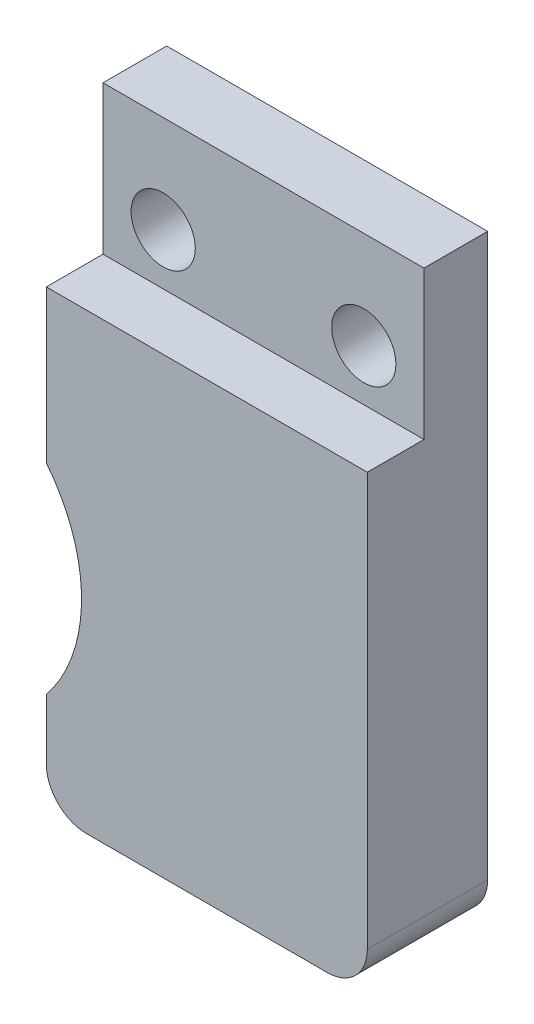
ISO-10303-21;
HEADER;
FILE_DESCRIPTION(('STEP AP214'),'2;1');
FILE_NAME('part.step','',(''),(''),'','','');
FILE_SCHEMA(('AUTOMOTIVE_DESIGN { 1 0 10303 214 1 1 1 1 }'));
ENDSEC;
DATA;
#1=APPLICATION_CONTEXT('core data for automotive mechanical design processes');
#2=APPLICATION_PROTOCOL_DEFINITION('international standard','automotive_design',2000,#1);
#3=PRODUCT_CONTEXT('',#1,'mechanical');
#4=PRODUCT('Part','Part','',(#3));
#5=PRODUCT_RELATED_PRODUCT_CATEGORY('part','',(#4));
#6=PRODUCT_DEFINITION_FORMATION('','',#4);
#7=PRODUCT_DEFINITION_CONTEXT('part definition',#1,'design');
#8=PRODUCT_DEFINITION('design','',#6,#7);
#9=PRODUCT_DEFINITION_SHAPE('','',#8);
#10=(LENGTH_UNIT() NAMED_UNIT(*) SI_UNIT(.MILLI.,.METRE.));
#11=(NAMED_UNIT(*) PLANE_ANGLE_UNIT() SI_UNIT($,.RADIAN.));
#12=(NAMED_UNIT(*) SI_UNIT($,.STERADIAN.) SOLID_ANGLE_UNIT());
#13=UNCERTAINTY_MEASURE_WITH_UNIT(LENGTH_MEASURE(1.E-05),#10,'distance_accuracy_value','');
#14=(GEOMETRIC_REPRESENTATION_CONTEXT(3) GLOBAL_UNCERTAINTY_ASSIGNED_CONTEXT((#13)) GLOBAL_UNIT_ASSIGNED_CONTEXT((#10,
#11,#12)) REPRESENTATION_CONTEXT('',''));
#15=CARTESIAN_POINT('',(0.,0.,0.));
#16=DIRECTION('',(0.,0.,1.));
#17=DIRECTION('',(1.,0.,0.));
#18=AXIS2_PLACEMENT_3D('',#15,#16,#17);
#19=CARTESIAN_POINT('',(-8.,-50.,3.175));
#20=DIRECTION('',(1.,0.,0.));
#21=DIRECTION('',(0.,1.,0.));
#22=AXIS2_PLACEMENT_3D('',#19,#20,#21);
#23=PLANE('',#22);
#24=DIRECTION('',(0.,-1.,0.));
#25=VECTOR('',#24,1.);
#26=CARTESIAN_POINT('',(-8.,-50.,0.));
#27=LINE('',#26,#25);
#28=CARTESIAN_POINT('',(-8.00000000000001,-20.,0.));
#29=VERTEX_POINT('',#28);
#30=CARTESIAN_POINT('',(-8.00000000000001,-35.,0.));
#31=VERTEX_POINT('',#30);
#32=EDGE_CURVE('E136',#29,#31,#27,.T.);
#33=ORIENTED_EDGE('',*,*,#32,.T.);
#34=DIRECTION('',(0.,0.,1.));
#35=VECTOR('',#34,1.);
#36=CARTESIAN_POINT('',(-8.00000000000001,-35.,0.));
#37=LINE('',#36,#35);
#38=CARTESIAN_POINT('',(-8.00000000000001,-35.,6.));
#39=VERTEX_POINT('',#38);
#40=EDGE_CURVE('E122',#31,#39,#37,.T.);
#41=ORIENTED_EDGE('',*,*,#40,.T.);
#42=DIRECTION('',(0.,1.,0.));
#43=VECTOR('',#42,1.);
#44=CARTESIAN_POINT('',(-8.,-50.,6.));
#45=LINE('',#44,#43);
#46=CARTESIAN_POINT('',(-8.00000000000001,-27.4,6.));
#47=VERTEX_POINT('',#46);
#48=EDGE_CURVE('E132',#39,#47,#45,.T.);
#49=ORIENTED_EDGE('',*,*,#48,.T.);
#50=DIRECTION('',(0.,0.,-1.));
#51=VECTOR('',#50,1.);
#52=CARTESIAN_POINT('',(-8.00000000000001,-27.4,6.));
#53=LINE('',#52,#51);
#54=CARTESIAN_POINT('',(-8.00000000000001,-27.4,3.175));
#55=VERTEX_POINT('',#54);
#56=EDGE_CURVE('E157',#47,#55,#53,.T.);
#57=ORIENTED_EDGE('',*,*,#56,.T.);
#58=DIRECTION('',(0.,-1.,0.));
#59=VECTOR('',#58,1.);
#60=CARTESIAN_POINT('',(-8.,-50.,3.175));
#61=LINE('',#60,#59);
#62=CARTESIAN_POINT('',(-8.00000000000001,-20.,3.175));
#63=VERTEX_POINT('',#62);
#64=EDGE_CURVE('E191',#63,#55,#61,.T.);
#65=ORIENTED_EDGE('',*,*,#64,.F.);
#66=DIRECTION('',(0.,0.,-1.));
#67=VECTOR('',#66,1.);
#68=CARTESIAN_POINT('',(-8.00000000000001,-20.,3.175));
#69=LINE('',#68,#67);
#70=EDGE_CURVE('E194',#63,#29,#69,.T.);
#71=ORIENTED_EDGE('',*,*,#70,.T.);
#72=EDGE_LOOP('',(#33,#41,#49,#57,#65,#71));
#73=FACE_BOUND('',#72,.T.);
#74=ADVANCED_FACE('F45',(#73),#23,.F.);
#75=CARTESIAN_POINT('',(0.,0.,3.175));
#76=DIRECTION('',(0.,0.,-1.));
#77=DIRECTION('',(-1.,0.,0.));
#78=AXIS2_PLACEMENT_3D('',#75,#76,#77);
#79=PLANE('',#78);
#80=ORIENTED_EDGE('',*,*,#64,.T.);
#81=DIRECTION('',(1.,0.,0.));
#82=VECTOR('',#81,1.);
#83=CARTESIAN_POINT('',(0.,-27.4,3.175));
#84=LINE('',#83,#82);
#85=CARTESIAN_POINT('',(8.,-27.4,3.175));
#86=VERTEX_POINT('',#85);
#87=EDGE_CURVE('E162',#55,#86,#84,.T.);
#88=ORIENTED_EDGE('',*,*,#87,.T.);
#89=DIRECTION('',(0.,1.,0.));
#90=VECTOR('',#89,1.);
#91=CARTESIAN_POINT('',(8.,-50.,3.175));
#92=LINE('',#91,#90);
#93=CARTESIAN_POINT('',(8.,-20.,3.175));
#94=VERTEX_POINT('',#93);
#95=EDGE_CURVE('E184',#86,#94,#92,.T.);
#96=ORIENTED_EDGE('',*,*,#95,.T.);
#97=DIRECTION('',(-1.,0.,0.));
#98=VECTOR('',#97,1.);
#99=CARTESIAN_POINT('',(-8.00000000000001,-20.,3.175));
#100=LINE('',#99,#98);
#101=EDGE_CURVE('E187',#94,#63,#100,.T.);
#102=ORIENTED_EDGE('',*,*,#101,.T.);
#103=EDGE_LOOP('',(#80,#88,#96,#102));
#104=FACE_BOUND('',#103,.T.);
#105=CARTESIAN_POINT('',(-5.00000000000001,-24.85,3.175));
#106=DIRECTION('',(0.,0.,1.));
#107=DIRECTION('',(1.,0.,0.));
#108=AXIS2_PLACEMENT_3D('',#105,#106,#107);
#109=CIRCLE('',#108,1.6);
#110=CARTESIAN_POINT('',(-3.40000000000001,-24.85,3.175));
#111=VERTEX_POINT('',#110);
#112=EDGE_CURVE('E176',#111,#111,#109,.T.);
#113=ORIENTED_EDGE('',*,*,#112,.F.);
#114=EDGE_LOOP('',(#113));
#115=FACE_BOUND('',#114,.T.);
#116=CARTESIAN_POINT('',(4.99999999999999,-24.85,3.175));
#117=DIRECTION('',(0.,0.,1.));
#118=DIRECTION('',(1.,0.,0.));
#119=AXIS2_PLACEMENT_3D('',#116,#117,#118);
#120=CIRCLE('',#119,1.59999999999999);
#121=CARTESIAN_POINT('',(6.59999999999999,-24.85,3.175));
#122=VERTEX_POINT('',#121);
#123=EDGE_CURVE('E168',#122,#122,#120,.T.);
#124=ORIENTED_EDGE('',*,*,#123,.F.);
#125=EDGE_LOOP('',(#124));
#126=FACE_BOUND('',#125,.T.);
#127=ADVANCED_FACE('F276',(#104,#115,#126),#79,.F.);
#128=CARTESIAN_POINT('',(0.,0.,0.));
#129=DIRECTION('',(0.,0.,-1.));
#130=DIRECTION('',(-1.,0.,0.));
#131=AXIS2_PLACEMENT_3D('',#128,#129,#130);
#132=PLANE('',#131);
#133=CARTESIAN_POINT('',(-14.2449979983984,-40.,0.));
#134=DIRECTION('',(0.,0.,1.));
#135=DIRECTION('',(1.,0.,0.));
#136=AXIS2_PLACEMENT_3D('',#133,#134,#135);
#137=CIRCLE('',#136,8.);
#138=CARTESIAN_POINT('',(-8.00000000000001,-45.,0.));
#139=VERTEX_POINT('',#138);
#140=EDGE_CURVE('E127',#139,#31,#137,.T.);
#141=ORIENTED_EDGE('',*,*,#140,.T.);
#142=ORIENTED_EDGE('',*,*,#32,.F.);
#143=DIRECTION('',(-1.,0.,0.));
#144=VECTOR('',#143,1.);
#145=CARTESIAN_POINT('',(-8.00000000000001,-20.,0.));
#146=LINE('',#145,#144);
#147=CARTESIAN_POINT('',(8.,-20.,0.));
#148=VERTEX_POINT('',#147);
#149=EDGE_CURVE('E197',#148,#29,#146,.T.);
#150=ORIENTED_EDGE('',*,*,#149,.F.);
#151=DIRECTION('',(0.,1.,0.));
#152=VECTOR('',#151,1.);
#153=CARTESIAN_POINT('',(8.,-50.,0.));
#154=LINE('',#153,#152);
#155=CARTESIAN_POINT('',(8.,-48.,0.));
#156=VERTEX_POINT('',#155);
#157=EDGE_CURVE('E180',#156,#148,#154,.T.);
#158=ORIENTED_EDGE('',*,*,#157,.F.);
#159=CARTESIAN_POINT('',(6.,-48.,0.));
#160=DIRECTION('',(0.,0.,-1.));
#161=DIRECTION('',(-1.,0.,0.));
#162=AXIS2_PLACEMENT_3D('',#159,#160,#161);
#163=CIRCLE('',#162,2.);
#164=CARTESIAN_POINT('',(6.,-50.,0.));
#165=VERTEX_POINT('',#164);
#166=EDGE_CURVE('E220',#156,#165,#163,.T.);
#167=ORIENTED_EDGE('',*,*,#166,.T.);
#168=DIRECTION('',(1.,0.,0.));
#169=VECTOR('',#168,1.);
#170=CARTESIAN_POINT('',(-8.,-50.,0.));
#171=LINE('',#170,#169);
#172=CARTESIAN_POINT('',(-6.,-50.,0.));
#173=VERTEX_POINT('',#172);
#174=EDGE_CURVE('E188',#173,#165,#171,.T.);
#175=ORIENTED_EDGE('',*,*,#174,.F.);
#176=CARTESIAN_POINT('',(-6.,-48.,0.));
#177=DIRECTION('',(0.,0.,-1.));
#178=DIRECTION('',(-1.,0.,0.));
#179=AXIS2_PLACEMENT_3D('',#176,#177,#178);
#180=CIRCLE('',#179,2.);
#181=CARTESIAN_POINT('',(-8.,-48.,0.));
#182=VERTEX_POINT('',#181);
#183=EDGE_CURVE('E216',#173,#182,#180,.T.);
#184=ORIENTED_EDGE('',*,*,#183,.T.);
#185=EDGE_CURVE('E200',#139,#182,#27,.T.);
#186=ORIENTED_EDGE('',*,*,#185,.F.);
#187=EDGE_LOOP('',(#141,#142,#150,#158,#167,#175,#184,#186));
#188=FACE_BOUND('',#187,.T.);
#189=CARTESIAN_POINT('',(-5.00000000000001,-24.85,0.));
#190=DIRECTION('',(0.,0.,1.));
#191=DIRECTION('',(1.,0.,0.));
#192=AXIS2_PLACEMENT_3D('',#189,#190,#191);
#193=CIRCLE('',#192,1.6);
#194=CARTESIAN_POINT('',(-3.40000000000001,-24.85,0.));
#195=VERTEX_POINT('',#194);
#196=EDGE_CURVE('E172',#195,#195,#193,.T.);
#197=ORIENTED_EDGE('',*,*,#196,.T.);
#198=EDGE_LOOP('',(#197));
#199=FACE_BOUND('',#198,.T.);
#200=CARTESIAN_POINT('',(4.99999999999999,-24.85,0.));
#201=DIRECTION('',(0.,0.,1.));
#202=DIRECTION('',(1.,0.,0.));
#203=AXIS2_PLACEMENT_3D('',#200,#201,#202);
#204=CIRCLE('',#203,1.59999999999999);
#205=CARTESIAN_POINT('',(6.59999999999999,-24.85,0.));
#206=VERTEX_POINT('',#205);
#207=EDGE_CURVE('E167',#206,#206,#204,.T.);
#208=ORIENTED_EDGE('',*,*,#207,.T.);
#209=EDGE_LOOP('',(#208));
#210=FACE_BOUND('',#209,.T.);
#211=ADVANCED_FACE('F247',(#188,#199,#210),#132,.T.);
#212=CARTESIAN_POINT('',(8.,-50.,3.175));
#213=DIRECTION('',(-1.,0.,0.));
#214=DIRECTION('',(0.,0.,1.));
#215=AXIS2_PLACEMENT_3D('',#212,#213,#214);
#216=PLANE('',#215);
#217=DIRECTION('',(0.,-1.,0.));
#218=VECTOR('',#217,1.);
#219=CARTESIAN_POINT('',(8.,-50.,6.));
#220=LINE('',#219,#218);
#221=CARTESIAN_POINT('',(8.,-27.4,6.));
#222=VERTEX_POINT('',#221);
#223=CARTESIAN_POINT('',(8.,-48.,6.));
#224=VERTEX_POINT('',#223);
#225=EDGE_CURVE('E151',#222,#224,#220,.T.);
#226=ORIENTED_EDGE('',*,*,#225,.T.);
#227=DIRECTION('',(0.,0.,-1.));
#228=VECTOR('',#227,1.);
#229=CARTESIAN_POINT('',(8.,-48.,3.175));
#230=LINE('',#229,#228);
#231=EDGE_CURVE('E212',#224,#156,#230,.T.);
#232=ORIENTED_EDGE('',*,*,#231,.T.);
#233=ORIENTED_EDGE('',*,*,#157,.T.);
#234=DIRECTION('',(0.,0.,-1.));
#235=VECTOR('',#234,1.);
#236=CARTESIAN_POINT('',(8.,-20.,3.175));
#237=LINE('',#236,#235);
#238=EDGE_CURVE('E208',#94,#148,#237,.T.);
#239=ORIENTED_EDGE('',*,*,#238,.F.);
#240=ORIENTED_EDGE('',*,*,#95,.F.);
#241=DIRECTION('',(0.,0.,-1.));
#242=VECTOR('',#241,1.);
#243=CARTESIAN_POINT('',(8.,-27.4,6.));
#244=LINE('',#243,#242);
#245=EDGE_CURVE('E158',#222,#86,#244,.T.);
#246=ORIENTED_EDGE('',*,*,#245,.F.);
#247=EDGE_LOOP('',(#226,#232,#233,#239,#240,#246));
#248=FACE_BOUND('',#247,.T.);
#249=ADVANCED_FACE('F240',(#248),#216,.F.);
#250=CARTESIAN_POINT('',(-8.00000000000001,-20.,3.175));
#251=DIRECTION('',(0.,-1.,0.));
#252=DIRECTION('',(1.,0.,0.));
#253=AXIS2_PLACEMENT_3D('',#250,#251,#252);
#254=PLANE('',#253);
#255=ORIENTED_EDGE('',*,*,#149,.T.);
#256=ORIENTED_EDGE('',*,*,#70,.F.);
#257=ORIENTED_EDGE('',*,*,#101,.F.);
#258=ORIENTED_EDGE('',*,*,#238,.T.);
#259=EDGE_LOOP('',(#255,#256,#257,#258));
#260=FACE_BOUND('',#259,.T.);
#261=ADVANCED_FACE('F263',(#260),#254,.F.);
#262=CARTESIAN_POINT('',(-8.,-48.,6.));
#263=VERTEX_POINT('',#262);
#264=CARTESIAN_POINT('',(-8.00000000000001,-45.,6.));
#265=VERTEX_POINT('',#264);
#266=EDGE_CURVE('E145',#263,#265,#45,.T.);
#267=ORIENTED_EDGE('',*,*,#266,.T.);
#268=DIRECTION('',(0.,0.,1.));
#269=VECTOR('',#268,1.);
#270=CARTESIAN_POINT('',(-8.00000000000001,-45.,0.));
#271=LINE('',#270,#269);
#272=EDGE_CURVE('E61',#139,#265,#271,.T.);
#273=ORIENTED_EDGE('',*,*,#272,.F.);
#274=ORIENTED_EDGE('',*,*,#185,.T.);
#275=DIRECTION('',(0.,0.,-1.));
#276=VECTOR('',#275,1.);
#277=CARTESIAN_POINT('',(-8.,-48.,3.175));
#278=LINE('',#277,#276);
#279=EDGE_CURVE('E11',#182,#263,#278,.F.);
#280=ORIENTED_EDGE('',*,*,#279,.T.);
#281=EDGE_LOOP('',(#267,#273,#274,#280));
#282=FACE_BOUND('',#281,.T.);
#283=ADVANCED_FACE('F257',(#282),#23,.F.);
#284=CARTESIAN_POINT('',(-8.,-50.,3.175));
#285=DIRECTION('',(0.,1.,0.));
#286=DIRECTION('',(0.,0.,1.));
#287=AXIS2_PLACEMENT_3D('',#284,#285,#286);
#288=PLANE('',#287);
#289=ORIENTED_EDGE('',*,*,#174,.T.);
#290=DIRECTION('',(0.,0.,-1.));
#291=VECTOR('',#290,1.);
#292=CARTESIAN_POINT('',(6.,-50.,3.175));
#293=LINE('',#292,#291);
#294=CARTESIAN_POINT('',(6.,-50.,6.));
#295=VERTEX_POINT('',#294);
#296=EDGE_CURVE('E227',#165,#295,#293,.F.);
#297=ORIENTED_EDGE('',*,*,#296,.T.);
#298=DIRECTION('',(-1.,0.,0.));
#299=VECTOR('',#298,1.);
#300=CARTESIAN_POINT('',(8.,-50.,6.));
#301=LINE('',#300,#299);
#302=CARTESIAN_POINT('',(-6.,-50.,6.));
#303=VERTEX_POINT('',#302);
#304=EDGE_CURVE('E146',#295,#303,#301,.T.);
#305=ORIENTED_EDGE('',*,*,#304,.T.);
#306=DIRECTION('',(0.,0.,-1.));
#307=VECTOR('',#306,1.);
#308=CARTESIAN_POINT('',(-6.,-50.,3.175));
#309=LINE('',#308,#307);
#310=EDGE_CURVE('E223',#303,#173,#309,.T.);
#311=ORIENTED_EDGE('',*,*,#310,.T.);
#312=EDGE_LOOP('',(#289,#297,#305,#311));
#313=FACE_BOUND('',#312,.T.);
#314=ADVANCED_FACE('F251',(#313),#288,.F.);
#315=CARTESIAN_POINT('',(-5.00000000000001,-24.85,3.175));
#316=DIRECTION('',(0.,0.,-1.));
#317=DIRECTION('',(-1.,0.,0.));
#318=AXIS2_PLACEMENT_3D('',#315,#316,#317);
#319=CYLINDRICAL_SURFACE('',#318,1.6);
#320=ORIENTED_EDGE('',*,*,#112,.T.);
#321=EDGE_LOOP('',(#320));
#322=FACE_BOUND('',#321,.T.);
#323=ORIENTED_EDGE('',*,*,#196,.F.);
#324=EDGE_LOOP('',(#323));
#325=FACE_BOUND('',#324,.T.);
#326=ADVANCED_FACE('F270',(#322,#325),#319,.F.);
#327=CARTESIAN_POINT('',(4.99999999999999,-24.85,3.175));
#328=DIRECTION('',(0.,0.,-1.));
#329=DIRECTION('',(-1.,0.,0.));
#330=AXIS2_PLACEMENT_3D('',#327,#328,#329);
#331=CYLINDRICAL_SURFACE('',#330,1.59999999999999);
#332=ORIENTED_EDGE('',*,*,#123,.T.);
#333=EDGE_LOOP('',(#332));
#334=FACE_BOUND('',#333,.T.);
#335=ORIENTED_EDGE('',*,*,#207,.F.);
#336=EDGE_LOOP('',(#335));
#337=FACE_BOUND('',#336,.T.);
#338=ADVANCED_FACE('F292',(#334,#337),#331,.F.);
#339=CARTESIAN_POINT('',(8.,-27.4,6.));
#340=DIRECTION('',(0.,1.,0.));
#341=DIRECTION('',(0.,0.,1.));
#342=AXIS2_PLACEMENT_3D('',#339,#340,#341);
#343=PLANE('',#342);
#344=ORIENTED_EDGE('',*,*,#87,.F.);
#345=ORIENTED_EDGE('',*,*,#56,.F.);
#346=DIRECTION('',(1.,0.,0.));
#347=VECTOR('',#346,1.);
#348=CARTESIAN_POINT('',(8.,-27.4,6.));
#349=LINE('',#348,#347);
#350=EDGE_CURVE('E143',#47,#222,#349,.T.);
#351=ORIENTED_EDGE('',*,*,#350,.T.);
#352=ORIENTED_EDGE('',*,*,#245,.T.);
#353=EDGE_LOOP('',(#344,#345,#351,#352));
#354=FACE_BOUND('',#353,.T.);
#355=ADVANCED_FACE('F295',(#354),#343,.T.);
#356=CARTESIAN_POINT('',(0.,0.,6.));
#357=DIRECTION('',(0.,0.,1.));
#358=DIRECTION('',(1.,0.,0.));
#359=AXIS2_PLACEMENT_3D('',#356,#357,#358);
#360=PLANE('',#359);
#361=CARTESIAN_POINT('',(-14.2449979983984,-40.,6.));
#362=DIRECTION('',(0.,0.,1.));
#363=DIRECTION('',(1.,0.,0.));
#364=AXIS2_PLACEMENT_3D('',#361,#362,#363);
#365=CIRCLE('',#364,8.);
#366=EDGE_CURVE('E119',#265,#39,#365,.T.);
#367=ORIENTED_EDGE('',*,*,#366,.F.);
#368=ORIENTED_EDGE('',*,*,#266,.F.);
#369=CARTESIAN_POINT('',(-6.,-48.,6.));
#370=DIRECTION('',(0.,0.,1.));
#371=DIRECTION('',(1.,0.,0.));
#372=AXIS2_PLACEMENT_3D('',#369,#370,#371);
#373=CIRCLE('',#372,2.);
#374=EDGE_CURVE('E230',#263,#303,#373,.T.);
#375=ORIENTED_EDGE('',*,*,#374,.T.);
#376=ORIENTED_EDGE('',*,*,#304,.F.);
#377=CARTESIAN_POINT('',(6.,-48.,6.));
#378=DIRECTION('',(0.,0.,1.));
#379=DIRECTION('',(1.,0.,0.));
#380=AXIS2_PLACEMENT_3D('',#377,#378,#379);
#381=CIRCLE('',#380,2.);
#382=EDGE_CURVE('E54',#295,#224,#381,.T.);
#383=ORIENTED_EDGE('',*,*,#382,.T.);
#384=ORIENTED_EDGE('',*,*,#225,.F.);
#385=ORIENTED_EDGE('',*,*,#350,.F.);
#386=ORIENTED_EDGE('',*,*,#48,.F.);
#387=EDGE_LOOP('',(#367,#368,#375,#376,#383,#384,#385,#386));
#388=FACE_BOUND('',#387,.T.);
#389=ADVANCED_FACE('F140',(#388),#360,.T.);
#390=CARTESIAN_POINT('',(6.,-48.,3.175));
#391=DIRECTION('',(0.,0.,-1.));
#392=DIRECTION('',(-1.,0.,0.));
#393=AXIS2_PLACEMENT_3D('',#390,#391,#392);
#394=CYLINDRICAL_SURFACE('',#393,2.);
#395=ORIENTED_EDGE('',*,*,#382,.F.);
#396=ORIENTED_EDGE('',*,*,#296,.F.);
#397=ORIENTED_EDGE('',*,*,#166,.F.);
#398=ORIENTED_EDGE('',*,*,#231,.F.);
#399=EDGE_LOOP('',(#395,#396,#397,#398));
#400=FACE_BOUND('',#399,.T.);
#401=ADVANCED_FACE('F244',(#400),#394,.T.);
#402=CARTESIAN_POINT('',(-6.,-48.,3.175));
#403=DIRECTION('',(0.,0.,-1.));
#404=DIRECTION('',(-1.,0.,0.));
#405=AXIS2_PLACEMENT_3D('',#402,#403,#404);
#406=CYLINDRICAL_SURFACE('',#405,2.);
#407=ORIENTED_EDGE('',*,*,#374,.F.);
#408=ORIENTED_EDGE('',*,*,#279,.F.);
#409=ORIENTED_EDGE('',*,*,#183,.F.);
#410=ORIENTED_EDGE('',*,*,#310,.F.);
#411=EDGE_LOOP('',(#407,#408,#409,#410));
#412=FACE_BOUND('',#411,.T.);
#413=ADVANCED_FACE('F47',(#412),#406,.T.);
#414=CARTESIAN_POINT('',(-14.2449979983984,-40.,0.));
#415=DIRECTION('',(0.,0.,1.));
#416=DIRECTION('',(1.,0.,0.));
#417=AXIS2_PLACEMENT_3D('',#414,#415,#416);
#418=CYLINDRICAL_SURFACE('',#417,8.);
#419=ORIENTED_EDGE('',*,*,#40,.F.);
#420=ORIENTED_EDGE('',*,*,#140,.F.);
#421=ORIENTED_EDGE('',*,*,#272,.T.);
#422=ORIENTED_EDGE('',*,*,#366,.T.);
#423=EDGE_LOOP('',(#419,#420,#421,#422));
#424=FACE_BOUND('',#423,.T.);
#425=ADVANCED_FACE('F121',(#424),#418,.F.);
#426=CLOSED_SHELL('',(#74,#127,#211,#249,#261,#283,#314,#326,#338,#355,#389,#401,#413,#425));
#427=MANIFOLD_SOLID_BREP('B2',#426);
#428=ADVANCED_BREP_SHAPE_REPRESENTATION('',(#18,#427),#14);
#429=SHAPE_DEFINITION_REPRESENTATION(#9,#428);
ENDSEC;
END-ISO-10303-21;
